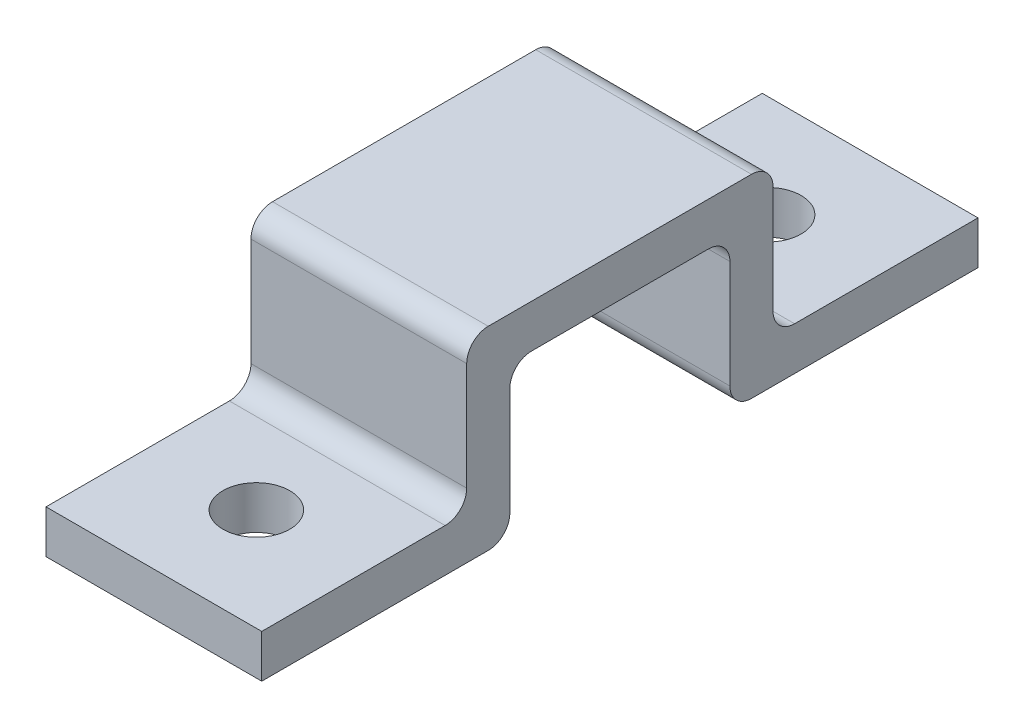
ISO-10303-21;
HEADER;
FILE_DESCRIPTION(('STEP AP214'),'2;1');
FILE_NAME('part.step','',(''),(''),'','','');
FILE_SCHEMA(('AUTOMOTIVE_DESIGN { 1 0 10303 214 1 1 1 1 }'));
ENDSEC;
DATA;
#1=APPLICATION_CONTEXT('core data for automotive mechanical design processes');
#2=APPLICATION_PROTOCOL_DEFINITION('international standard','automotive_design',2000,#1);
#3=PRODUCT_CONTEXT('',#1,'mechanical');
#4=PRODUCT('Part','Part','',(#3));
#5=PRODUCT_RELATED_PRODUCT_CATEGORY('part','',(#4));
#6=PRODUCT_DEFINITION_FORMATION('','',#4);
#7=PRODUCT_DEFINITION_CONTEXT('part definition',#1,'design');
#8=PRODUCT_DEFINITION('design','',#6,#7);
#9=PRODUCT_DEFINITION_SHAPE('','',#8);
#10=(LENGTH_UNIT() NAMED_UNIT(*) SI_UNIT(.MILLI.,.METRE.));
#11=(NAMED_UNIT(*) PLANE_ANGLE_UNIT() SI_UNIT($,.RADIAN.));
#12=(NAMED_UNIT(*) SI_UNIT($,.STERADIAN.) SOLID_ANGLE_UNIT());
#13=UNCERTAINTY_MEASURE_WITH_UNIT(LENGTH_MEASURE(1.E-05),#10,'distance_accuracy_value','');
#14=(GEOMETRIC_REPRESENTATION_CONTEXT(3) GLOBAL_UNCERTAINTY_ASSIGNED_CONTEXT((#13)) GLOBAL_UNIT_ASSIGNED_CONTEXT((#10,
#11,#12)) REPRESENTATION_CONTEXT('',''));
#15=CARTESIAN_POINT('',(0.,0.,0.));
#16=DIRECTION('',(0.,0.,1.));
#17=DIRECTION('',(1.,0.,0.));
#18=AXIS2_PLACEMENT_3D('',#15,#16,#17);
#19=CARTESIAN_POINT('',(20.,0.,10.2));
#20=DIRECTION('',(0.,0.,1.));
#21=DIRECTION('',(0.,-1.,0.));
#22=AXIS2_PLACEMENT_3D('',#19,#20,#21);
#23=PLANE('',#22);
#24=DIRECTION('',(0.,1.,0.));
#25=VECTOR('',#24,1.);
#26=CARTESIAN_POINT('',(20.,0.,10.2));
#27=LINE('',#26,#25);
#28=CARTESIAN_POINT('',(20.,-12.,10.2));
#29=VERTEX_POINT('',#28);
#30=CARTESIAN_POINT('',(20.,-2.,10.2));
#31=VERTEX_POINT('',#30);
#32=EDGE_CURVE('E252',#29,#31,#27,.T.);
#33=ORIENTED_EDGE('',*,*,#32,.F.);
#34=DIRECTION('',(-1.,0.,0.));
#35=VECTOR('',#34,1.);
#36=CARTESIAN_POINT('',(20.,-12.,10.2));
#37=LINE('',#36,#35);
#38=CARTESIAN_POINT('',(0.,-12.,10.2));
#39=VERTEX_POINT('',#38);
#40=EDGE_CURVE('E285',#29,#39,#37,.T.);
#41=ORIENTED_EDGE('',*,*,#40,.T.);
#42=DIRECTION('',(0.,1.,0.));
#43=VECTOR('',#42,1.);
#44=CARTESIAN_POINT('',(0.,0.,10.2));
#45=LINE('',#44,#43);
#46=CARTESIAN_POINT('',(0.,-2.,10.2));
#47=VERTEX_POINT('',#46);
#48=EDGE_CURVE('E221',#39,#47,#45,.T.);
#49=ORIENTED_EDGE('',*,*,#48,.T.);
#50=DIRECTION('',(-1.,0.,0.));
#51=VECTOR('',#50,1.);
#52=CARTESIAN_POINT('',(20.,-2.,10.2));
#53=LINE('',#52,#51);
#54=EDGE_CURVE('E283',#47,#31,#53,.F.);
#55=ORIENTED_EDGE('',*,*,#54,.T.);
#56=EDGE_LOOP('',(#33,#41,#49,#55));
#57=FACE_BOUND('',#56,.T.);
#58=ADVANCED_FACE('F36',(#57),#23,.F.);
#59=CARTESIAN_POINT('',(20.,0.,10.2));
#60=DIRECTION('',(0.,1.,0.));
#61=DIRECTION('',(0.,0.,1.));
#62=AXIS2_PLACEMENT_3D('',#59,#60,#61);
#63=PLANE('',#62);
#64=DIRECTION('',(0.,0.,-1.));
#65=VECTOR('',#64,1.);
#66=CARTESIAN_POINT('',(20.,0.,10.2));
#67=LINE('',#66,#65);
#68=CARTESIAN_POINT('',(20.,0.,8.2));
#69=VERTEX_POINT('',#68);
#70=CARTESIAN_POINT('',(20.,0.,-8.2));
#71=VERTEX_POINT('',#70);
#72=EDGE_CURVE('E336',#69,#71,#67,.T.);
#73=ORIENTED_EDGE('',*,*,#72,.F.);
#74=DIRECTION('',(-1.,0.,0.));
#75=VECTOR('',#74,1.);
#76=CARTESIAN_POINT('',(0.,0.,8.2));
#77=LINE('',#76,#75);
#78=CARTESIAN_POINT('',(0.,0.,8.2));
#79=VERTEX_POINT('',#78);
#80=EDGE_CURVE('E308',#69,#79,#77,.T.);
#81=ORIENTED_EDGE('',*,*,#80,.T.);
#82=DIRECTION('',(0.,0.,-1.));
#83=VECTOR('',#82,1.);
#84=CARTESIAN_POINT('',(0.,0.,10.2));
#85=LINE('',#84,#83);
#86=CARTESIAN_POINT('',(0.,0.,-8.2));
#87=VERTEX_POINT('',#86);
#88=EDGE_CURVE('E224',#79,#87,#85,.T.);
#89=ORIENTED_EDGE('',*,*,#88,.T.);
#90=DIRECTION('',(-1.,0.,0.));
#91=VECTOR('',#90,1.);
#92=CARTESIAN_POINT('',(20.,0.,-8.2));
#93=LINE('',#92,#91);
#94=EDGE_CURVE('E306',#87,#71,#93,.F.);
#95=ORIENTED_EDGE('',*,*,#94,.T.);
#96=EDGE_LOOP('',(#73,#81,#89,#95));
#97=FACE_BOUND('',#96,.T.);
#98=ADVANCED_FACE('F331',(#97),#63,.F.);
#99=CARTESIAN_POINT('',(20.,0.,-10.2));
#100=DIRECTION('',(0.,0.,-1.));
#101=DIRECTION('',(0.,1.,0.));
#102=AXIS2_PLACEMENT_3D('',#99,#100,#101);
#103=PLANE('',#102);
#104=DIRECTION('',(0.,-1.,0.));
#105=VECTOR('',#104,1.);
#106=CARTESIAN_POINT('',(0.,0.,-10.2));
#107=LINE('',#106,#105);
#108=CARTESIAN_POINT('',(0.,-2.,-10.2));
#109=VERTEX_POINT('',#108);
#110=CARTESIAN_POINT('',(0.,-12.,-10.2));
#111=VERTEX_POINT('',#110);
#112=EDGE_CURVE('E228',#109,#111,#107,.T.);
#113=ORIENTED_EDGE('',*,*,#112,.T.);
#114=DIRECTION('',(-1.,0.,0.));
#115=VECTOR('',#114,1.);
#116=CARTESIAN_POINT('',(20.,-12.,-10.2));
#117=LINE('',#116,#115);
#118=CARTESIAN_POINT('',(20.,-12.,-10.2));
#119=VERTEX_POINT('',#118);
#120=EDGE_CURVE('E294',#111,#119,#117,.F.);
#121=ORIENTED_EDGE('',*,*,#120,.T.);
#122=DIRECTION('',(0.,-1.,0.));
#123=VECTOR('',#122,1.);
#124=CARTESIAN_POINT('',(20.,0.,-10.2));
#125=LINE('',#124,#123);
#126=CARTESIAN_POINT('',(20.,-2.,-10.2));
#127=VERTEX_POINT('',#126);
#128=EDGE_CURVE('E187',#127,#119,#125,.T.);
#129=ORIENTED_EDGE('',*,*,#128,.F.);
#130=DIRECTION('',(-1.,0.,0.));
#131=VECTOR('',#130,1.);
#132=CARTESIAN_POINT('',(0.,-2.,-10.2));
#133=LINE('',#132,#131);
#134=EDGE_CURVE('E291',#127,#109,#133,.T.);
#135=ORIENTED_EDGE('',*,*,#134,.T.);
#136=EDGE_LOOP('',(#113,#121,#129,#135));
#137=FACE_BOUND('',#136,.T.);
#138=ADVANCED_FACE('F338',(#137),#103,.F.);
#139=CARTESIAN_POINT('',(20.,-14.,-10.2));
#140=DIRECTION('',(0.,1.,0.));
#141=DIRECTION('',(0.,0.,1.));
#142=AXIS2_PLACEMENT_3D('',#139,#140,#141);
#143=PLANE('',#142);
#144=CARTESIAN_POINT('',(10.,-14.,-23.7));
#145=DIRECTION('',(0.,1.,0.));
#146=DIRECTION('',(0.,0.,1.));
#147=AXIS2_PLACEMENT_3D('',#144,#145,#146);
#148=CIRCLE('',#147,3.1);
#149=CARTESIAN_POINT('',(10.,-14.,-20.6));
#150=VERTEX_POINT('',#149);
#151=EDGE_CURVE('E225',#150,#150,#148,.F.);
#152=ORIENTED_EDGE('',*,*,#151,.F.);
#153=EDGE_LOOP('',(#152));
#154=FACE_BOUND('',#153,.T.);
#155=DIRECTION('',(0.,0.,-1.));
#156=VECTOR('',#155,1.);
#157=CARTESIAN_POINT('',(20.,-14.,-10.2));
#158=LINE('',#157,#156);
#159=CARTESIAN_POINT('',(20.,-14.,-12.2));
#160=VERTEX_POINT('',#159);
#161=CARTESIAN_POINT('',(20.,-14.,-33.2));
#162=VERTEX_POINT('',#161);
#163=EDGE_CURVE('E173',#160,#162,#158,.T.);
#164=ORIENTED_EDGE('',*,*,#163,.F.);
#165=DIRECTION('',(-1.,0.,0.));
#166=VECTOR('',#165,1.);
#167=CARTESIAN_POINT('',(20.,-14.,-12.2));
#168=LINE('',#167,#166);
#169=CARTESIAN_POINT('',(0.,-14.,-12.2));
#170=VERTEX_POINT('',#169);
#171=EDGE_CURVE('E289',#160,#170,#168,.T.);
#172=ORIENTED_EDGE('',*,*,#171,.T.);
#173=DIRECTION('',(0.,0.,-1.));
#174=VECTOR('',#173,1.);
#175=CARTESIAN_POINT('',(0.,-14.,-10.2));
#176=LINE('',#175,#174);
#177=CARTESIAN_POINT('',(0.,-14.,-33.2));
#178=VERTEX_POINT('',#177);
#179=EDGE_CURVE('E193',#170,#178,#176,.T.);
#180=ORIENTED_EDGE('',*,*,#179,.T.);
#181=DIRECTION('',(-1.,0.,0.));
#182=VECTOR('',#181,1.);
#183=CARTESIAN_POINT('',(20.,-14.,-33.2));
#184=LINE('',#183,#182);
#185=EDGE_CURVE('E190',#162,#178,#184,.T.);
#186=ORIENTED_EDGE('',*,*,#185,.F.);
#187=EDGE_LOOP('',(#164,#172,#180,#186));
#188=FACE_BOUND('',#187,.T.);
#189=ADVANCED_FACE('F191',(#154,#188),#143,.F.);
#190=CARTESIAN_POINT('',(20.,-14.,-33.2));
#191=DIRECTION('',(0.,0.,1.));
#192=DIRECTION('',(0.,-1.,0.));
#193=AXIS2_PLACEMENT_3D('',#190,#191,#192);
#194=PLANE('',#193);
#195=DIRECTION('',(0.,1.,0.));
#196=VECTOR('',#195,1.);
#197=CARTESIAN_POINT('',(0.,-14.,-33.2));
#198=LINE('',#197,#196);
#199=CARTESIAN_POINT('',(0.,-10.,-33.2));
#200=VERTEX_POINT('',#199);
#201=EDGE_CURVE('E232',#178,#200,#198,.T.);
#202=ORIENTED_EDGE('',*,*,#201,.T.);
#203=DIRECTION('',(-1.,0.,0.));
#204=VECTOR('',#203,1.);
#205=CARTESIAN_POINT('',(20.,-10.,-33.2));
#206=LINE('',#205,#204);
#207=CARTESIAN_POINT('',(20.,-10.,-33.2));
#208=VERTEX_POINT('',#207);
#209=EDGE_CURVE('E197',#208,#200,#206,.T.);
#210=ORIENTED_EDGE('',*,*,#209,.F.);
#211=DIRECTION('',(0.,1.,0.));
#212=VECTOR('',#211,1.);
#213=CARTESIAN_POINT('',(20.,-14.,-33.2));
#214=LINE('',#213,#212);
#215=EDGE_CURVE('E179',#162,#208,#214,.T.);
#216=ORIENTED_EDGE('',*,*,#215,.F.);
#217=ORIENTED_EDGE('',*,*,#185,.T.);
#218=EDGE_LOOP('',(#202,#210,#216,#217));
#219=FACE_BOUND('',#218,.T.);
#220=ADVANCED_FACE('F199',(#219),#194,.F.);
#221=CARTESIAN_POINT('',(20.,-10.,-33.2));
#222=DIRECTION('',(0.,-1.,0.));
#223=DIRECTION('',(0.,0.,-1.));
#224=AXIS2_PLACEMENT_3D('',#221,#222,#223);
#225=PLANE('',#224);
#226=CARTESIAN_POINT('',(10.,-10.,-23.7));
#227=DIRECTION('',(0.,1.,0.));
#228=DIRECTION('',(0.,0.,1.));
#229=AXIS2_PLACEMENT_3D('',#226,#227,#228);
#230=CIRCLE('',#229,3.1);
#231=CARTESIAN_POINT('',(10.,-10.,-20.6));
#232=VERTEX_POINT('',#231);
#233=EDGE_CURVE('E346',#232,#232,#230,.T.);
#234=ORIENTED_EDGE('',*,*,#233,.F.);
#235=EDGE_LOOP('',(#234));
#236=FACE_BOUND('',#235,.T.);
#237=DIRECTION('',(0.,0.,1.));
#238=VECTOR('',#237,1.);
#239=CARTESIAN_POINT('',(0.,-10.,-33.2));
#240=LINE('',#239,#238);
#241=CARTESIAN_POINT('',(0.,-10.,-16.2));
#242=VERTEX_POINT('',#241);
#243=EDGE_CURVE('E234',#200,#242,#240,.T.);
#244=ORIENTED_EDGE('',*,*,#243,.T.);
#245=DIRECTION('',(-1.,0.,0.));
#246=VECTOR('',#245,1.);
#247=CARTESIAN_POINT('',(20.,-10.,-16.2));
#248=LINE('',#247,#246);
#249=CARTESIAN_POINT('',(20.,-10.,-16.2));
#250=VERTEX_POINT('',#249);
#251=EDGE_CURVE('E301',#242,#250,#248,.F.);
#252=ORIENTED_EDGE('',*,*,#251,.T.);
#253=DIRECTION('',(0.,0.,1.));
#254=VECTOR('',#253,1.);
#255=CARTESIAN_POINT('',(20.,-10.,-33.2));
#256=LINE('',#255,#254);
#257=EDGE_CURVE('E202',#208,#250,#256,.T.);
#258=ORIENTED_EDGE('',*,*,#257,.F.);
#259=ORIENTED_EDGE('',*,*,#209,.T.);
#260=EDGE_LOOP('',(#244,#252,#258,#259));
#261=FACE_BOUND('',#260,.T.);
#262=ADVANCED_FACE('F447',(#236,#261),#225,.F.);
#263=CARTESIAN_POINT('',(20.,-10.,-14.2));
#264=DIRECTION('',(0.,0.,1.));
#265=DIRECTION('',(0.,-1.,0.));
#266=AXIS2_PLACEMENT_3D('',#263,#264,#265);
#267=PLANE('',#266);
#268=DIRECTION('',(0.,1.,0.));
#269=VECTOR('',#268,1.);
#270=CARTESIAN_POINT('',(20.,-10.,-14.2));
#271=LINE('',#270,#269);
#272=CARTESIAN_POINT('',(20.,-8.,-14.2));
#273=VERTEX_POINT('',#272);
#274=CARTESIAN_POINT('',(20.,1.99999999999999,-14.2));
#275=VERTEX_POINT('',#274);
#276=EDGE_CURVE('E204',#273,#275,#271,.T.);
#277=ORIENTED_EDGE('',*,*,#276,.F.);
#278=DIRECTION('',(-1.,0.,0.));
#279=VECTOR('',#278,1.);
#280=CARTESIAN_POINT('',(0.,-8.,-14.2));
#281=LINE('',#280,#279);
#282=CARTESIAN_POINT('',(0.,-8.,-14.2));
#283=VERTEX_POINT('',#282);
#284=EDGE_CURVE('E298',#273,#283,#281,.T.);
#285=ORIENTED_EDGE('',*,*,#284,.T.);
#286=DIRECTION('',(0.,1.,0.));
#287=VECTOR('',#286,1.);
#288=CARTESIAN_POINT('',(0.,-10.,-14.2));
#289=LINE('',#288,#287);
#290=CARTESIAN_POINT('',(0.,1.99999999999999,-14.2));
#291=VERTEX_POINT('',#290);
#292=EDGE_CURVE('E237',#283,#291,#289,.T.);
#293=ORIENTED_EDGE('',*,*,#292,.T.);
#294=DIRECTION('',(-1.,0.,0.));
#295=VECTOR('',#294,1.);
#296=CARTESIAN_POINT('',(20.,2.,-14.2));
#297=LINE('',#296,#295);
#298=EDGE_CURVE('E296',#291,#275,#297,.F.);
#299=ORIENTED_EDGE('',*,*,#298,.T.);
#300=EDGE_LOOP('',(#277,#285,#293,#299));
#301=FACE_BOUND('',#300,.T.);
#302=ADVANCED_FACE('F441',(#301),#267,.F.);
#303=CARTESIAN_POINT('',(20.,4.,-14.2));
#304=DIRECTION('',(0.,-1.,0.));
#305=DIRECTION('',(0.,0.,-1.));
#306=AXIS2_PLACEMENT_3D('',#303,#304,#305);
#307=PLANE('',#306);
#308=DIRECTION('',(0.,0.,1.));
#309=VECTOR('',#308,1.);
#310=CARTESIAN_POINT('',(0.,4.,-14.2));
#311=LINE('',#310,#309);
#312=CARTESIAN_POINT('',(0.,4.,-12.2));
#313=VERTEX_POINT('',#312);
#314=CARTESIAN_POINT('',(0.,4.,12.2));
#315=VERTEX_POINT('',#314);
#316=EDGE_CURVE('E240',#313,#315,#311,.T.);
#317=ORIENTED_EDGE('',*,*,#316,.T.);
#318=DIRECTION('',(-1.,0.,0.));
#319=VECTOR('',#318,1.);
#320=CARTESIAN_POINT('',(20.,4.,12.2));
#321=LINE('',#320,#319);
#322=CARTESIAN_POINT('',(20.,4.,12.2));
#323=VERTEX_POINT('',#322);
#324=EDGE_CURVE('E274',#315,#323,#321,.F.);
#325=ORIENTED_EDGE('',*,*,#324,.T.);
#326=DIRECTION('',(0.,0.,1.));
#327=VECTOR('',#326,1.);
#328=CARTESIAN_POINT('',(20.,4.,-14.2));
#329=LINE('',#328,#327);
#330=CARTESIAN_POINT('',(20.,4.,-12.2));
#331=VERTEX_POINT('',#330);
#332=EDGE_CURVE('E210',#331,#323,#329,.T.);
#333=ORIENTED_EDGE('',*,*,#332,.F.);
#334=DIRECTION('',(-1.,0.,0.));
#335=VECTOR('',#334,1.);
#336=CARTESIAN_POINT('',(20.,4.,-12.2));
#337=LINE('',#336,#335);
#338=EDGE_CURVE('E271',#331,#313,#337,.T.);
#339=ORIENTED_EDGE('',*,*,#338,.T.);
#340=EDGE_LOOP('',(#317,#325,#333,#339));
#341=FACE_BOUND('',#340,.T.);
#342=ADVANCED_FACE('F434',(#341),#307,.F.);
#343=CARTESIAN_POINT('',(20.,-10.,14.2));
#344=DIRECTION('',(0.,0.,-1.));
#345=DIRECTION('',(0.,1.,0.));
#346=AXIS2_PLACEMENT_3D('',#343,#344,#345);
#347=PLANE('',#346);
#348=DIRECTION('',(0.,-1.,0.));
#349=VECTOR('',#348,1.);
#350=CARTESIAN_POINT('',(20.,-10.,14.2));
#351=LINE('',#350,#349);
#352=CARTESIAN_POINT('',(20.,1.99999999999999,14.2));
#353=VERTEX_POINT('',#352);
#354=CARTESIAN_POINT('',(20.,-8.,14.2));
#355=VERTEX_POINT('',#354);
#356=EDGE_CURVE('E212',#353,#355,#351,.T.);
#357=ORIENTED_EDGE('',*,*,#356,.F.);
#358=DIRECTION('',(-1.,0.,0.));
#359=VECTOR('',#358,1.);
#360=CARTESIAN_POINT('',(20.,2.,14.2));
#361=LINE('',#360,#359);
#362=CARTESIAN_POINT('',(0.,1.99999999999999,14.2));
#363=VERTEX_POINT('',#362);
#364=EDGE_CURVE('E260',#353,#363,#361,.T.);
#365=ORIENTED_EDGE('',*,*,#364,.T.);
#366=DIRECTION('',(0.,-1.,0.));
#367=VECTOR('',#366,1.);
#368=CARTESIAN_POINT('',(0.,-10.,14.2));
#369=LINE('',#368,#367);
#370=CARTESIAN_POINT('',(0.,-8.,14.2));
#371=VERTEX_POINT('',#370);
#372=EDGE_CURVE('E243',#363,#371,#369,.T.);
#373=ORIENTED_EDGE('',*,*,#372,.T.);
#374=DIRECTION('',(-1.,0.,0.));
#375=VECTOR('',#374,1.);
#376=CARTESIAN_POINT('',(20.,-8.,14.2));
#377=LINE('',#376,#375);
#378=EDGE_CURVE('E196',#371,#355,#377,.F.);
#379=ORIENTED_EDGE('',*,*,#378,.T.);
#380=EDGE_LOOP('',(#357,#365,#373,#379));
#381=FACE_BOUND('',#380,.T.);
#382=ADVANCED_FACE('F427',(#381),#347,.F.);
#383=CARTESIAN_POINT('',(20.,-10.,33.2));
#384=DIRECTION('',(0.,-1.,0.));
#385=DIRECTION('',(0.,0.,-1.));
#386=AXIS2_PLACEMENT_3D('',#383,#384,#385);
#387=PLANE('',#386);
#388=CARTESIAN_POINT('',(10.,-10.,23.7));
#389=DIRECTION('',(0.,-1.,0.));
#390=DIRECTION('',(0.,0.,-1.));
#391=AXIS2_PLACEMENT_3D('',#388,#389,#390);
#392=CIRCLE('',#391,3.1);
#393=CARTESIAN_POINT('',(10.,-10.,26.8));
#394=VERTEX_POINT('',#393);
#395=EDGE_CURVE('E352',#394,#394,#392,.T.);
#396=ORIENTED_EDGE('',*,*,#395,.T.);
#397=EDGE_LOOP('',(#396));
#398=FACE_BOUND('',#397,.T.);
#399=DIRECTION('',(0.,0.,1.));
#400=VECTOR('',#399,1.);
#401=CARTESIAN_POINT('',(20.,-10.,33.2));
#402=LINE('',#401,#400);
#403=CARTESIAN_POINT('',(20.,-10.,16.2));
#404=VERTEX_POINT('',#403);
#405=CARTESIAN_POINT('',(20.,-10.,33.2));
#406=VERTEX_POINT('',#405);
#407=EDGE_CURVE('E214',#404,#406,#402,.T.);
#408=ORIENTED_EDGE('',*,*,#407,.F.);
#409=DIRECTION('',(-1.,0.,0.));
#410=VECTOR('',#409,1.);
#411=CARTESIAN_POINT('',(0.,-10.,16.2));
#412=LINE('',#411,#410);
#413=CARTESIAN_POINT('',(0.,-10.,16.2));
#414=VERTEX_POINT('',#413);
#415=EDGE_CURVE('E303',#404,#414,#412,.T.);
#416=ORIENTED_EDGE('',*,*,#415,.T.);
#417=DIRECTION('',(0.,0.,1.));
#418=VECTOR('',#417,1.);
#419=CARTESIAN_POINT('',(0.,-10.,33.2));
#420=LINE('',#419,#418);
#421=CARTESIAN_POINT('',(0.,-10.,33.2));
#422=VERTEX_POINT('',#421);
#423=EDGE_CURVE('E246',#414,#422,#420,.T.);
#424=ORIENTED_EDGE('',*,*,#423,.T.);
#425=DIRECTION('',(-1.,0.,0.));
#426=VECTOR('',#425,1.);
#427=CARTESIAN_POINT('',(20.,-10.,33.2));
#428=LINE('',#427,#426);
#429=EDGE_CURVE('E255',#406,#422,#428,.T.);
#430=ORIENTED_EDGE('',*,*,#429,.F.);
#431=EDGE_LOOP('',(#408,#416,#424,#430));
#432=FACE_BOUND('',#431,.T.);
#433=ADVANCED_FACE('F356',(#398,#432),#387,.F.);
#434=CARTESIAN_POINT('',(20.,-14.,33.2));
#435=DIRECTION('',(0.,0.,-1.));
#436=DIRECTION('',(0.,1.,0.));
#437=AXIS2_PLACEMENT_3D('',#434,#435,#436);
#438=PLANE('',#437);
#439=DIRECTION('',(0.,-1.,0.));
#440=VECTOR('',#439,1.);
#441=CARTESIAN_POINT('',(0.,-14.,33.2));
#442=LINE('',#441,#440);
#443=CARTESIAN_POINT('',(0.,-14.,33.2));
#444=VERTEX_POINT('',#443);
#445=EDGE_CURVE('E248',#422,#444,#442,.T.);
#446=ORIENTED_EDGE('',*,*,#445,.T.);
#447=DIRECTION('',(-1.,0.,0.));
#448=VECTOR('',#447,1.);
#449=CARTESIAN_POINT('',(20.,-14.,33.2));
#450=LINE('',#449,#448);
#451=CARTESIAN_POINT('',(20.,-14.,33.2));
#452=VERTEX_POINT('',#451);
#453=EDGE_CURVE('E220',#452,#444,#450,.T.);
#454=ORIENTED_EDGE('',*,*,#453,.F.);
#455=DIRECTION('',(0.,-1.,0.));
#456=VECTOR('',#455,1.);
#457=CARTESIAN_POINT('',(20.,-14.,33.2));
#458=LINE('',#457,#456);
#459=EDGE_CURVE('E216',#406,#452,#458,.T.);
#460=ORIENTED_EDGE('',*,*,#459,.F.);
#461=ORIENTED_EDGE('',*,*,#429,.T.);
#462=EDGE_LOOP('',(#446,#454,#460,#461));
#463=FACE_BOUND('',#462,.T.);
#464=ADVANCED_FACE('F420',(#463),#438,.F.);
#465=CARTESIAN_POINT('',(20.,-14.,10.2));
#466=DIRECTION('',(0.,1.,0.));
#467=DIRECTION('',(0.,0.,1.));
#468=AXIS2_PLACEMENT_3D('',#465,#466,#467);
#469=PLANE('',#468);
#470=CARTESIAN_POINT('',(10.,-14.,23.7));
#471=DIRECTION('',(0.,1.,0.));
#472=DIRECTION('',(0.,0.,1.));
#473=AXIS2_PLACEMENT_3D('',#470,#471,#472);
#474=CIRCLE('',#473,3.1);
#475=CARTESIAN_POINT('',(10.,-14.,26.8));
#476=VERTEX_POINT('',#475);
#477=EDGE_CURVE('E349',#476,#476,#474,.T.);
#478=ORIENTED_EDGE('',*,*,#477,.T.);
#479=EDGE_LOOP('',(#478));
#480=FACE_BOUND('',#479,.T.);
#481=DIRECTION('',(0.,0.,-1.));
#482=VECTOR('',#481,1.);
#483=CARTESIAN_POINT('',(0.,-14.,10.2));
#484=LINE('',#483,#482);
#485=CARTESIAN_POINT('',(0.,-14.,12.2));
#486=VERTEX_POINT('',#485);
#487=EDGE_CURVE('E250',#444,#486,#484,.T.);
#488=ORIENTED_EDGE('',*,*,#487,.T.);
#489=DIRECTION('',(-1.,0.,0.));
#490=VECTOR('',#489,1.);
#491=CARTESIAN_POINT('',(20.,-14.,12.2));
#492=LINE('',#491,#490);
#493=CARTESIAN_POINT('',(20.,-14.,12.2));
#494=VERTEX_POINT('',#493);
#495=EDGE_CURVE('E51',#486,#494,#492,.F.);
#496=ORIENTED_EDGE('',*,*,#495,.T.);
#497=DIRECTION('',(0.,0.,-1.));
#498=VECTOR('',#497,1.);
#499=CARTESIAN_POINT('',(20.,-14.,10.2));
#500=LINE('',#499,#498);
#501=EDGE_CURVE('E218',#452,#494,#500,.T.);
#502=ORIENTED_EDGE('',*,*,#501,.F.);
#503=ORIENTED_EDGE('',*,*,#453,.T.);
#504=EDGE_LOOP('',(#488,#496,#502,#503));
#505=FACE_BOUND('',#504,.T.);
#506=ADVANCED_FACE('F416',(#480,#505),#469,.F.);
#507=CARTESIAN_POINT('',(20.,0.,0.));
#508=DIRECTION('',(-1.,0.,0.));
#509=DIRECTION('',(0.,0.,1.));
#510=AXIS2_PLACEMENT_3D('',#507,#508,#509);
#511=PLANE('',#510);
#512=ORIENTED_EDGE('',*,*,#332,.T.);
#513=CARTESIAN_POINT('',(20.,2.,12.2));
#514=DIRECTION('',(-1.,0.,0.));
#515=DIRECTION('',(0.,0.,1.));
#516=AXIS2_PLACEMENT_3D('',#513,#514,#515);
#517=CIRCLE('',#516,2.);
#518=EDGE_CURVE('E281',#323,#353,#517,.F.);
#519=ORIENTED_EDGE('',*,*,#518,.T.);
#520=ORIENTED_EDGE('',*,*,#356,.T.);
#521=CARTESIAN_POINT('',(20.,-8.,16.2));
#522=DIRECTION('',(-1.,0.,0.));
#523=DIRECTION('',(0.,0.,1.));
#524=AXIS2_PLACEMENT_3D('',#521,#522,#523);
#525=CIRCLE('',#524,2.);
#526=EDGE_CURVE('E59',#355,#404,#525,.T.);
#527=ORIENTED_EDGE('',*,*,#526,.T.);
#528=ORIENTED_EDGE('',*,*,#407,.T.);
#529=ORIENTED_EDGE('',*,*,#459,.T.);
#530=ORIENTED_EDGE('',*,*,#501,.T.);
#531=CARTESIAN_POINT('',(20.,-12.,12.2));
#532=DIRECTION('',(-1.,0.,0.));
#533=DIRECTION('',(0.,0.,1.));
#534=AXIS2_PLACEMENT_3D('',#531,#532,#533);
#535=CIRCLE('',#534,2.);
#536=EDGE_CURVE('E279',#494,#29,#535,.F.);
#537=ORIENTED_EDGE('',*,*,#536,.T.);
#538=ORIENTED_EDGE('',*,*,#32,.T.);
#539=CARTESIAN_POINT('',(20.,-2.,8.2));
#540=DIRECTION('',(-1.,0.,0.));
#541=DIRECTION('',(0.,0.,1.));
#542=AXIS2_PLACEMENT_3D('',#539,#540,#541);
#543=CIRCLE('',#542,2.);
#544=EDGE_CURVE('E320',#31,#69,#543,.T.);
#545=ORIENTED_EDGE('',*,*,#544,.T.);
#546=ORIENTED_EDGE('',*,*,#72,.T.);
#547=CARTESIAN_POINT('',(20.,-2.,-8.2));
#548=DIRECTION('',(-1.,0.,0.));
#549=DIRECTION('',(0.,0.,1.));
#550=AXIS2_PLACEMENT_3D('',#547,#548,#549);
#551=CIRCLE('',#550,2.);
#552=EDGE_CURVE('E11',#71,#127,#551,.T.);
#553=ORIENTED_EDGE('',*,*,#552,.T.);
#554=ORIENTED_EDGE('',*,*,#128,.T.);
#555=CARTESIAN_POINT('',(20.,-12.,-12.2));
#556=DIRECTION('',(-1.,0.,0.));
#557=DIRECTION('',(0.,0.,1.));
#558=AXIS2_PLACEMENT_3D('',#555,#556,#557);
#559=CIRCLE('',#558,2.);
#560=EDGE_CURVE('E183',#119,#160,#559,.F.);
#561=ORIENTED_EDGE('',*,*,#560,.T.);
#562=ORIENTED_EDGE('',*,*,#163,.T.);
#563=ORIENTED_EDGE('',*,*,#215,.T.);
#564=ORIENTED_EDGE('',*,*,#257,.T.);
#565=CARTESIAN_POINT('',(20.,-8.,-16.2));
#566=DIRECTION('',(-1.,0.,0.));
#567=DIRECTION('',(0.,0.,1.));
#568=AXIS2_PLACEMENT_3D('',#565,#566,#567);
#569=CIRCLE('',#568,2.);
#570=EDGE_CURVE('E313',#250,#273,#569,.T.);
#571=ORIENTED_EDGE('',*,*,#570,.T.);
#572=ORIENTED_EDGE('',*,*,#276,.T.);
#573=CARTESIAN_POINT('',(20.,2.,-12.2));
#574=DIRECTION('',(-1.,0.,0.));
#575=DIRECTION('',(0.,0.,1.));
#576=AXIS2_PLACEMENT_3D('',#573,#574,#575);
#577=CIRCLE('',#576,2.);
#578=EDGE_CURVE('E276',#275,#331,#577,.F.);
#579=ORIENTED_EDGE('',*,*,#578,.T.);
#580=EDGE_LOOP('',(#512,#519,#520,#527,#528,#529,#530,#537,#538,#545,#546,#553,#554,#561,#562,
#563,#564,#571,#572,#579));
#581=FACE_BOUND('',#580,.T.);
#582=ADVANCED_FACE('F176',(#581),#511,.F.);
#583=CARTESIAN_POINT('',(0.,0.,0.));
#584=DIRECTION('',(-1.,0.,0.));
#585=DIRECTION('',(0.,0.,1.));
#586=AXIS2_PLACEMENT_3D('',#583,#584,#585);
#587=PLANE('',#586);
#588=ORIENTED_EDGE('',*,*,#372,.F.);
#589=CARTESIAN_POINT('',(0.,2.,12.2));
#590=DIRECTION('',(-1.,0.,0.));
#591=DIRECTION('',(0.,0.,1.));
#592=AXIS2_PLACEMENT_3D('',#589,#590,#591);
#593=CIRCLE('',#592,2.);
#594=EDGE_CURVE('E269',#363,#315,#593,.T.);
#595=ORIENTED_EDGE('',*,*,#594,.T.);
#596=ORIENTED_EDGE('',*,*,#316,.F.);
#597=CARTESIAN_POINT('',(0.,2.,-12.2));
#598=DIRECTION('',(-1.,0.,0.));
#599=DIRECTION('',(0.,0.,1.));
#600=AXIS2_PLACEMENT_3D('',#597,#598,#599);
#601=CIRCLE('',#600,2.);
#602=EDGE_CURVE('E263',#313,#291,#601,.T.);
#603=ORIENTED_EDGE('',*,*,#602,.T.);
#604=ORIENTED_EDGE('',*,*,#292,.F.);
#605=CARTESIAN_POINT('',(0.,-8.,-16.2));
#606=DIRECTION('',(-1.,0.,0.));
#607=DIRECTION('',(0.,0.,1.));
#608=AXIS2_PLACEMENT_3D('',#605,#606,#607);
#609=CIRCLE('',#608,2.);
#610=EDGE_CURVE('E311',#283,#242,#609,.F.);
#611=ORIENTED_EDGE('',*,*,#610,.T.);
#612=ORIENTED_EDGE('',*,*,#243,.F.);
#613=ORIENTED_EDGE('',*,*,#201,.F.);
#614=ORIENTED_EDGE('',*,*,#179,.F.);
#615=CARTESIAN_POINT('',(0.,-12.,-12.2));
#616=DIRECTION('',(-1.,0.,0.));
#617=DIRECTION('',(0.,0.,1.));
#618=AXIS2_PLACEMENT_3D('',#615,#616,#617);
#619=CIRCLE('',#618,2.);
#620=EDGE_CURVE('E265',#170,#111,#619,.T.);
#621=ORIENTED_EDGE('',*,*,#620,.T.);
#622=ORIENTED_EDGE('',*,*,#112,.F.);
#623=CARTESIAN_POINT('',(0.,-2.,-8.2));
#624=DIRECTION('',(-1.,0.,0.));
#625=DIRECTION('',(0.,0.,1.));
#626=AXIS2_PLACEMENT_3D('',#623,#624,#625);
#627=CIRCLE('',#626,2.);
#628=EDGE_CURVE('E44',#109,#87,#627,.F.);
#629=ORIENTED_EDGE('',*,*,#628,.T.);
#630=ORIENTED_EDGE('',*,*,#88,.F.);
#631=CARTESIAN_POINT('',(0.,-2.,8.2));
#632=DIRECTION('',(-1.,0.,0.));
#633=DIRECTION('',(0.,0.,1.));
#634=AXIS2_PLACEMENT_3D('',#631,#632,#633);
#635=CIRCLE('',#634,2.);
#636=EDGE_CURVE('E318',#79,#47,#635,.F.);
#637=ORIENTED_EDGE('',*,*,#636,.T.);
#638=ORIENTED_EDGE('',*,*,#48,.F.);
#639=CARTESIAN_POINT('',(0.,-12.,12.2));
#640=DIRECTION('',(-1.,0.,0.));
#641=DIRECTION('',(0.,0.,1.));
#642=AXIS2_PLACEMENT_3D('',#639,#640,#641);
#643=CIRCLE('',#642,2.);
#644=EDGE_CURVE('E267',#39,#486,#643,.T.);
#645=ORIENTED_EDGE('',*,*,#644,.T.);
#646=ORIENTED_EDGE('',*,*,#487,.F.);
#647=ORIENTED_EDGE('',*,*,#445,.F.);
#648=ORIENTED_EDGE('',*,*,#423,.F.);
#649=CARTESIAN_POINT('',(0.,-8.,16.2));
#650=DIRECTION('',(-1.,0.,0.));
#651=DIRECTION('',(0.,0.,1.));
#652=AXIS2_PLACEMENT_3D('',#649,#650,#651);
#653=CIRCLE('',#652,2.);
#654=EDGE_CURVE('E315',#414,#371,#653,.F.);
#655=ORIENTED_EDGE('',*,*,#654,.T.);
#656=EDGE_LOOP('',(#588,#595,#596,#603,#604,#611,#612,#613,#614,#621,#622,#629,#630,#637,#638,
#645,#646,#647,#648,#655));
#657=FACE_BOUND('',#656,.T.);
#658=ADVANCED_FACE('F325',(#657),#587,.T.);
#659=CARTESIAN_POINT('',(10.,-22.7681240867132,-23.7));
#660=DIRECTION('',(0.,1.,0.));
#661=DIRECTION('',(0.,0.,1.));
#662=AXIS2_PLACEMENT_3D('',#659,#660,#661);
#663=CYLINDRICAL_SURFACE('',#662,3.1);
#664=CARTESIAN_POINT('',(10.,-14.,-20.6));
#665=CARTESIAN_POINT('',(10.,-13.9583333333333,-20.6));
#666=CARTESIAN_POINT('',(10.,-13.9166666666667,-20.6));
#667=CARTESIAN_POINT('',(10.,-13.8333333333333,-20.6));
#668=CARTESIAN_POINT('',(10.,-13.7916666666667,-20.6));
#669=CARTESIAN_POINT('',(10.,-13.7083333333333,-20.6));
#670=CARTESIAN_POINT('',(10.,-13.6666666666667,-20.6));
#671=CARTESIAN_POINT('',(10.,-13.5833333333333,-20.6));
#672=CARTESIAN_POINT('',(10.,-13.5416666666667,-20.6));
#673=CARTESIAN_POINT('',(10.,-13.4583333333333,-20.6));
#674=CARTESIAN_POINT('',(10.,-13.4166666666667,-20.6));
#675=CARTESIAN_POINT('',(10.,-13.3333333333333,-20.6));
#676=CARTESIAN_POINT('',(10.,-13.2916666666667,-20.6));
#677=CARTESIAN_POINT('',(10.,-13.2083333333333,-20.6));
#678=CARTESIAN_POINT('',(10.,-13.1666666666667,-20.6));
#679=CARTESIAN_POINT('',(10.,-13.0833333333333,-20.6));
#680=CARTESIAN_POINT('',(10.,-13.0416666666667,-20.6));
#681=CARTESIAN_POINT('',(10.,-12.9583333333333,-20.6));
#682=CARTESIAN_POINT('',(10.,-12.9166666666667,-20.6));
#683=CARTESIAN_POINT('',(10.,-12.8333333333333,-20.6));
#684=CARTESIAN_POINT('',(10.,-12.7916666666667,-20.6));
#685=CARTESIAN_POINT('',(10.,-12.7083333333333,-20.6));
#686=CARTESIAN_POINT('',(10.,-12.6666666666667,-20.6));
#687=CARTESIAN_POINT('',(10.,-12.5833333333333,-20.6));
#688=CARTESIAN_POINT('',(10.,-12.5416666666667,-20.6));
#689=CARTESIAN_POINT('',(10.,-12.4583333333333,-20.6));
#690=CARTESIAN_POINT('',(10.,-12.4166666666667,-20.6));
#691=CARTESIAN_POINT('',(10.,-12.3333333333333,-20.6));
#692=CARTESIAN_POINT('',(10.,-12.2916666666667,-20.6));
#693=CARTESIAN_POINT('',(10.,-12.2083333333333,-20.6));
#694=CARTESIAN_POINT('',(10.,-12.1666666666667,-20.6));
#695=CARTESIAN_POINT('',(10.,-12.0833333333333,-20.6));
#696=CARTESIAN_POINT('',(10.,-12.0416666666667,-20.6));
#697=CARTESIAN_POINT('',(10.,-11.9583333333333,-20.6));
#698=CARTESIAN_POINT('',(10.,-11.9166666666667,-20.6));
#699=CARTESIAN_POINT('',(10.,-11.8333333333333,-20.6));
#700=CARTESIAN_POINT('',(10.,-11.7916666666667,-20.6));
#701=CARTESIAN_POINT('',(10.,-11.7083333333333,-20.6));
#702=CARTESIAN_POINT('',(10.,-11.6666666666667,-20.6));
#703=CARTESIAN_POINT('',(10.,-11.5833333333333,-20.6));
#704=CARTESIAN_POINT('',(10.,-11.5416666666667,-20.6));
#705=CARTESIAN_POINT('',(10.,-11.4583333333333,-20.6));
#706=CARTESIAN_POINT('',(10.,-11.4166666666667,-20.6));
#707=CARTESIAN_POINT('',(10.,-11.3333333333333,-20.6));
#708=CARTESIAN_POINT('',(10.,-11.2916666666667,-20.6));
#709=CARTESIAN_POINT('',(10.,-11.2083333333333,-20.6));
#710=CARTESIAN_POINT('',(10.,-11.1666666666667,-20.6));
#711=CARTESIAN_POINT('',(10.,-11.0833333333333,-20.6));
#712=CARTESIAN_POINT('',(10.,-11.0416666666667,-20.6));
#713=CARTESIAN_POINT('',(10.,-10.9583333333333,-20.6));
#714=CARTESIAN_POINT('',(10.,-10.9166666666667,-20.6));
#715=CARTESIAN_POINT('',(10.,-10.8333333333333,-20.6));
#716=CARTESIAN_POINT('',(10.,-10.7916666666667,-20.6));
#717=CARTESIAN_POINT('',(10.,-10.7083333333333,-20.6));
#718=CARTESIAN_POINT('',(10.,-10.6666666666667,-20.6));
#719=CARTESIAN_POINT('',(10.,-10.5833333333333,-20.6));
#720=CARTESIAN_POINT('',(10.,-10.5416666666667,-20.6));
#721=CARTESIAN_POINT('',(10.,-10.4583333333333,-20.6));
#722=CARTESIAN_POINT('',(10.,-10.4166666666667,-20.6));
#723=CARTESIAN_POINT('',(10.,-10.3333333333333,-20.6));
#724=CARTESIAN_POINT('',(10.,-10.2916666666667,-20.6));
#725=CARTESIAN_POINT('',(10.,-10.2083333333333,-20.6));
#726=CARTESIAN_POINT('',(10.,-10.1666666666667,-20.6));
#727=CARTESIAN_POINT('',(10.,-10.0833333333333,-20.6));
#728=CARTESIAN_POINT('',(10.,-10.0416666666667,-20.6));
#729=CARTESIAN_POINT('',(10.,-10.,-20.6));
#730=B_SPLINE_CURVE_WITH_KNOTS('',3,(#664,#665,#666,#667,#668,#669,#670,#671,#672,#673,#674,
#675,#676,#677,#678,#679,#680,#681,#682,#683,#684,#685,#686,#687,#688,#689,#690,#691,#692,#693,
#694,#695,#696,#697,#698,#699,#700,#701,#702,#703,#704,#705,#706,#707,#708,#709,#710,#711,#712,
#713,#714,#715,#716,#717,#718,#719,#720,#721,#722,#723,#724,#725,#726,#727,#728,#729),
.UNSPECIFIED.,.F.,.F.,(4,2,2,2,2,2,2,2,2,2,2,2,2,2,2,2,2,2,2,2,2,2,2,2,2,2,2,2,2,2,2,2,4),(0.,
0.125,0.25,0.375,0.5,0.624999999999999,0.749999999999999,0.874999999999999,0.999999999999999,
1.125,1.25,1.375,1.5,1.625,1.75,1.875,2.,2.125,2.25,2.375,2.5,2.625,2.75,2.875,3.,3.125,3.25,
3.375,3.5,3.625,3.75,3.875,4.),.UNSPECIFIED.);
#731=EDGE_CURVE('BSEAM362',#150,#232,#730,.T.);
#732=ORIENTED_EDGE('',*,*,#151,.T.);
#733=ORIENTED_EDGE('',*,*,#233,.T.);
#734=ORIENTED_EDGE('',*,*,#731,.T.);
#735=ORIENTED_EDGE('',*,*,#731,.F.);
#736=EDGE_LOOP('',(#732,#734,#733,#735));
#737=FACE_BOUND('',#736,.T.);
#738=ADVANCED_FACE('F362',(#737),#663,.F.);
#739=CARTESIAN_POINT('',(10.,-22.7681240867132,23.7));
#740=DIRECTION('',(0.,1.,0.));
#741=DIRECTION('',(0.,0.,1.));
#742=AXIS2_PLACEMENT_3D('',#739,#740,#741);
#743=CYLINDRICAL_SURFACE('',#742,3.1);
#744=CARTESIAN_POINT('',(10.,-14.,26.8));
#745=CARTESIAN_POINT('',(10.,-13.9583333333333,26.8));
#746=CARTESIAN_POINT('',(10.,-13.9166666666667,26.8));
#747=CARTESIAN_POINT('',(10.,-13.8333333333333,26.8));
#748=CARTESIAN_POINT('',(10.,-13.7916666666667,26.8));
#749=CARTESIAN_POINT('',(10.,-13.7083333333333,26.8));
#750=CARTESIAN_POINT('',(10.,-13.6666666666667,26.8));
#751=CARTESIAN_POINT('',(10.,-13.5833333333333,26.8));
#752=CARTESIAN_POINT('',(10.,-13.5416666666667,26.8));
#753=CARTESIAN_POINT('',(10.,-13.4583333333333,26.8));
#754=CARTESIAN_POINT('',(10.,-13.4166666666667,26.8));
#755=CARTESIAN_POINT('',(10.,-13.3333333333333,26.8));
#756=CARTESIAN_POINT('',(10.,-13.2916666666667,26.8));
#757=CARTESIAN_POINT('',(10.,-13.2083333333333,26.8));
#758=CARTESIAN_POINT('',(10.,-13.1666666666667,26.8));
#759=CARTESIAN_POINT('',(10.,-13.0833333333333,26.8));
#760=CARTESIAN_POINT('',(10.,-13.0416666666667,26.8));
#761=CARTESIAN_POINT('',(10.,-12.9583333333333,26.8));
#762=CARTESIAN_POINT('',(10.,-12.9166666666667,26.8));
#763=CARTESIAN_POINT('',(10.,-12.8333333333333,26.8));
#764=CARTESIAN_POINT('',(10.,-12.7916666666667,26.8));
#765=CARTESIAN_POINT('',(10.,-12.7083333333333,26.8));
#766=CARTESIAN_POINT('',(10.,-12.6666666666667,26.8));
#767=CARTESIAN_POINT('',(10.,-12.5833333333333,26.8));
#768=CARTESIAN_POINT('',(10.,-12.5416666666667,26.8));
#769=CARTESIAN_POINT('',(10.,-12.4583333333333,26.8));
#770=CARTESIAN_POINT('',(10.,-12.4166666666667,26.8));
#771=CARTESIAN_POINT('',(10.,-12.3333333333333,26.8));
#772=CARTESIAN_POINT('',(10.,-12.2916666666667,26.8));
#773=CARTESIAN_POINT('',(10.,-12.2083333333333,26.8));
#774=CARTESIAN_POINT('',(10.,-12.1666666666667,26.8));
#775=CARTESIAN_POINT('',(10.,-12.0833333333333,26.8));
#776=CARTESIAN_POINT('',(10.,-12.0416666666667,26.8));
#777=CARTESIAN_POINT('',(10.,-11.9583333333333,26.8));
#778=CARTESIAN_POINT('',(10.,-11.9166666666667,26.8));
#779=CARTESIAN_POINT('',(10.,-11.8333333333333,26.8));
#780=CARTESIAN_POINT('',(10.,-11.7916666666667,26.8));
#781=CARTESIAN_POINT('',(10.,-11.7083333333333,26.8));
#782=CARTESIAN_POINT('',(10.,-11.6666666666667,26.8));
#783=CARTESIAN_POINT('',(10.,-11.5833333333333,26.8));
#784=CARTESIAN_POINT('',(10.,-11.5416666666667,26.8));
#785=CARTESIAN_POINT('',(10.,-11.4583333333333,26.8));
#786=CARTESIAN_POINT('',(10.,-11.4166666666667,26.8));
#787=CARTESIAN_POINT('',(10.,-11.3333333333333,26.8));
#788=CARTESIAN_POINT('',(10.,-11.2916666666667,26.8));
#789=CARTESIAN_POINT('',(10.,-11.2083333333333,26.8));
#790=CARTESIAN_POINT('',(10.,-11.1666666666667,26.8));
#791=CARTESIAN_POINT('',(10.,-11.0833333333333,26.8));
#792=CARTESIAN_POINT('',(10.,-11.0416666666667,26.8));
#793=CARTESIAN_POINT('',(10.,-10.9583333333333,26.8));
#794=CARTESIAN_POINT('',(10.,-10.9166666666667,26.8));
#795=CARTESIAN_POINT('',(10.,-10.8333333333333,26.8));
#796=CARTESIAN_POINT('',(10.,-10.7916666666667,26.8));
#797=CARTESIAN_POINT('',(10.,-10.7083333333333,26.8));
#798=CARTESIAN_POINT('',(10.,-10.6666666666667,26.8));
#799=CARTESIAN_POINT('',(10.,-10.5833333333333,26.8));
#800=CARTESIAN_POINT('',(10.,-10.5416666666667,26.8));
#801=CARTESIAN_POINT('',(10.,-10.4583333333333,26.8));
#802=CARTESIAN_POINT('',(10.,-10.4166666666667,26.8));
#803=CARTESIAN_POINT('',(10.,-10.3333333333333,26.8));
#804=CARTESIAN_POINT('',(10.,-10.2916666666667,26.8));
#805=CARTESIAN_POINT('',(10.,-10.2083333333333,26.8));
#806=CARTESIAN_POINT('',(10.,-10.1666666666667,26.8));
#807=CARTESIAN_POINT('',(10.,-10.0833333333333,26.8));
#808=CARTESIAN_POINT('',(10.,-10.0416666666667,26.8));
#809=CARTESIAN_POINT('',(10.,-10.,26.8));
#810=B_SPLINE_CURVE_WITH_KNOTS('',3,(#744,#745,#746,#747,#748,#749,#750,#751,#752,#753,#754,
#755,#756,#757,#758,#759,#760,#761,#762,#763,#764,#765,#766,#767,#768,#769,#770,#771,#772,#773,
#774,#775,#776,#777,#778,#779,#780,#781,#782,#783,#784,#785,#786,#787,#788,#789,#790,#791,#792,
#793,#794,#795,#796,#797,#798,#799,#800,#801,#802,#803,#804,#805,#806,#807,#808,#809),
.UNSPECIFIED.,.F.,.F.,(4,2,2,2,2,2,2,2,2,2,2,2,2,2,2,2,2,2,2,2,2,2,2,2,2,2,2,2,2,2,2,2,4),(0.,
0.125,0.25,0.375,0.5,0.625000000000001,0.750000000000001,0.875000000000001,1.,1.125,1.25,1.375,
1.5,1.625,1.75,1.875,2.,2.125,2.25,2.375,2.5,2.625,2.75,2.875,3.,3.125,3.25,3.375,3.5,3.625,
3.75,3.875,4.),.UNSPECIFIED.);
#811=EDGE_CURVE('BSEAM359',#476,#394,#810,.T.);
#812=ORIENTED_EDGE('',*,*,#477,.F.);
#813=ORIENTED_EDGE('',*,*,#395,.F.);
#814=ORIENTED_EDGE('',*,*,#811,.T.);
#815=ORIENTED_EDGE('',*,*,#811,.F.);
#816=EDGE_LOOP('',(#812,#814,#813,#815));
#817=FACE_BOUND('',#816,.T.);
#818=ADVANCED_FACE('F359',(#817),#743,.F.);
#819=CARTESIAN_POINT('',(20.,2.,12.2));
#820=DIRECTION('',(-1.,0.,0.));
#821=DIRECTION('',(0.,0.,1.));
#822=AXIS2_PLACEMENT_3D('',#819,#820,#821);
#823=CYLINDRICAL_SURFACE('',#822,2.);
#824=ORIENTED_EDGE('',*,*,#518,.F.);
#825=ORIENTED_EDGE('',*,*,#324,.F.);
#826=ORIENTED_EDGE('',*,*,#594,.F.);
#827=ORIENTED_EDGE('',*,*,#364,.F.);
#828=EDGE_LOOP('',(#824,#825,#826,#827));
#829=FACE_BOUND('',#828,.T.);
#830=ADVANCED_FACE('F361',(#829),#823,.T.);
#831=CARTESIAN_POINT('',(20.,-12.,12.2));
#832=DIRECTION('',(-1.,0.,0.));
#833=DIRECTION('',(0.,0.,1.));
#834=AXIS2_PLACEMENT_3D('',#831,#832,#833);
#835=CYLINDRICAL_SURFACE('',#834,2.);
#836=ORIENTED_EDGE('',*,*,#536,.F.);
#837=ORIENTED_EDGE('',*,*,#495,.F.);
#838=ORIENTED_EDGE('',*,*,#644,.F.);
#839=ORIENTED_EDGE('',*,*,#40,.F.);
#840=EDGE_LOOP('',(#836,#837,#838,#839));
#841=FACE_BOUND('',#840,.T.);
#842=ADVANCED_FACE('F369',(#841),#835,.T.);
#843=CARTESIAN_POINT('',(20.,-12.,-12.2));
#844=DIRECTION('',(-1.,0.,0.));
#845=DIRECTION('',(0.,0.,1.));
#846=AXIS2_PLACEMENT_3D('',#843,#844,#845);
#847=CYLINDRICAL_SURFACE('',#846,2.);
#848=ORIENTED_EDGE('',*,*,#560,.F.);
#849=ORIENTED_EDGE('',*,*,#120,.F.);
#850=ORIENTED_EDGE('',*,*,#620,.F.);
#851=ORIENTED_EDGE('',*,*,#171,.F.);
#852=EDGE_LOOP('',(#848,#849,#850,#851));
#853=FACE_BOUND('',#852,.T.);
#854=ADVANCED_FACE('F387',(#853),#847,.T.);
#855=CARTESIAN_POINT('',(20.,-8.,-16.2));
#856=DIRECTION('',(1.,0.,0.));
#857=DIRECTION('',(0.,0.,-1.));
#858=AXIS2_PLACEMENT_3D('',#855,#856,#857);
#859=CYLINDRICAL_SURFACE('',#858,2.);
#860=ORIENTED_EDGE('',*,*,#570,.F.);
#861=ORIENTED_EDGE('',*,*,#251,.F.);
#862=ORIENTED_EDGE('',*,*,#610,.F.);
#863=ORIENTED_EDGE('',*,*,#284,.F.);
#864=EDGE_LOOP('',(#860,#861,#862,#863));
#865=FACE_BOUND('',#864,.T.);
#866=ADVANCED_FACE('F391',(#865),#859,.F.);
#867=CARTESIAN_POINT('',(20.,-8.,16.2));
#868=DIRECTION('',(1.,0.,0.));
#869=DIRECTION('',(0.,0.,-1.));
#870=AXIS2_PLACEMENT_3D('',#867,#868,#869);
#871=CYLINDRICAL_SURFACE('',#870,2.);
#872=ORIENTED_EDGE('',*,*,#526,.F.);
#873=ORIENTED_EDGE('',*,*,#378,.F.);
#874=ORIENTED_EDGE('',*,*,#654,.F.);
#875=ORIENTED_EDGE('',*,*,#415,.F.);
#876=EDGE_LOOP('',(#872,#873,#874,#875));
#877=FACE_BOUND('',#876,.T.);
#878=ADVANCED_FACE('F395',(#877),#871,.F.);
#879=CARTESIAN_POINT('',(20.,2.,-12.2));
#880=DIRECTION('',(-1.,0.,0.));
#881=DIRECTION('',(0.,0.,1.));
#882=AXIS2_PLACEMENT_3D('',#879,#880,#881);
#883=CYLINDRICAL_SURFACE('',#882,2.);
#884=ORIENTED_EDGE('',*,*,#578,.F.);
#885=ORIENTED_EDGE('',*,*,#298,.F.);
#886=ORIENTED_EDGE('',*,*,#602,.F.);
#887=ORIENTED_EDGE('',*,*,#338,.F.);
#888=EDGE_LOOP('',(#884,#885,#886,#887));
#889=FACE_BOUND('',#888,.T.);
#890=ADVANCED_FACE('F399',(#889),#883,.T.);
#891=CARTESIAN_POINT('',(20.,-2.,8.2));
#892=DIRECTION('',(1.,0.,0.));
#893=DIRECTION('',(0.,0.,-1.));
#894=AXIS2_PLACEMENT_3D('',#891,#892,#893);
#895=CYLINDRICAL_SURFACE('',#894,2.);
#896=ORIENTED_EDGE('',*,*,#544,.F.);
#897=ORIENTED_EDGE('',*,*,#54,.F.);
#898=ORIENTED_EDGE('',*,*,#636,.F.);
#899=ORIENTED_EDGE('',*,*,#80,.F.);
#900=EDGE_LOOP('',(#896,#897,#898,#899));
#901=FACE_BOUND('',#900,.T.);
#902=ADVANCED_FACE('F402',(#901),#895,.F.);
#903=CARTESIAN_POINT('',(20.,-2.,-8.2));
#904=DIRECTION('',(1.,0.,0.));
#905=DIRECTION('',(0.,0.,-1.));
#906=AXIS2_PLACEMENT_3D('',#903,#904,#905);
#907=CYLINDRICAL_SURFACE('',#906,2.);
#908=ORIENTED_EDGE('',*,*,#552,.F.);
#909=ORIENTED_EDGE('',*,*,#94,.F.);
#910=ORIENTED_EDGE('',*,*,#628,.F.);
#911=ORIENTED_EDGE('',*,*,#134,.F.);
#912=EDGE_LOOP('',(#908,#909,#910,#911));
#913=FACE_BOUND('',#912,.T.);
#914=ADVANCED_FACE('F38',(#913),#907,.F.);
#915=CLOSED_SHELL('',(#58,#98,#138,#189,#220,#262,#302,#342,#382,#433,#464,#506,#582,#658,#738,
#818,#830,#842,#854,#866,#878,#890,#902,#914));
#916=MANIFOLD_SOLID_BREP('B2',#915);
#917=ADVANCED_BREP_SHAPE_REPRESENTATION('',(#18,#916),#14);
#918=SHAPE_DEFINITION_REPRESENTATION(#9,#917);
ENDSEC;
END-ISO-10303-21;
